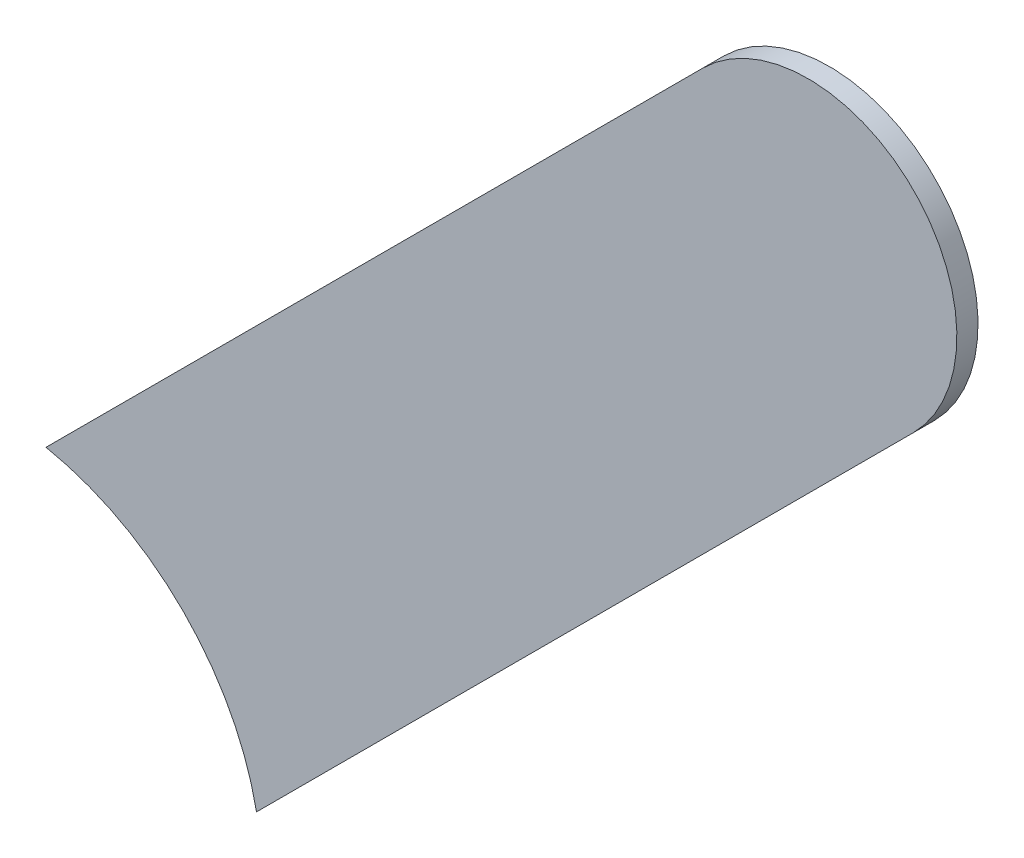
ISO-10303-21;
HEADER;
FILE_DESCRIPTION(('STEP AP214'),'2;1');
FILE_NAME('part.step','',(''),(''),'','','');
FILE_SCHEMA(('AUTOMOTIVE_DESIGN { 1 0 10303 214 1 1 1 1 }'));
ENDSEC;
DATA;
#1=APPLICATION_CONTEXT('core data for automotive mechanical design processes');
#2=APPLICATION_PROTOCOL_DEFINITION('international standard','automotive_design',2000,#1);
#3=PRODUCT_CONTEXT('',#1,'mechanical');
#4=PRODUCT('Part','Part','',(#3));
#5=PRODUCT_RELATED_PRODUCT_CATEGORY('part','',(#4));
#6=PRODUCT_DEFINITION_FORMATION('','',#4);
#7=PRODUCT_DEFINITION_CONTEXT('part definition',#1,'design');
#8=PRODUCT_DEFINITION('design','',#6,#7);
#9=PRODUCT_DEFINITION_SHAPE('','',#8);
#10=(LENGTH_UNIT() NAMED_UNIT(*) SI_UNIT(.MILLI.,.METRE.));
#11=(NAMED_UNIT(*) PLANE_ANGLE_UNIT() SI_UNIT($,.RADIAN.));
#12=(NAMED_UNIT(*) SI_UNIT($,.STERADIAN.) SOLID_ANGLE_UNIT());
#13=UNCERTAINTY_MEASURE_WITH_UNIT(LENGTH_MEASURE(1.E-05),#10,'distance_accuracy_value','');
#14=(GEOMETRIC_REPRESENTATION_CONTEXT(3) GLOBAL_UNCERTAINTY_ASSIGNED_CONTEXT((#13)) GLOBAL_UNIT_ASSIGNED_CONTEXT((#10,
#11,#12)) REPRESENTATION_CONTEXT('',''));
#15=CARTESIAN_POINT('',(0.,0.,0.));
#16=DIRECTION('',(0.,0.,1.));
#17=DIRECTION('',(1.,0.,0.));
#18=AXIS2_PLACEMENT_3D('',#15,#16,#17);
#19=CARTESIAN_POINT('',(34.3413517363948,98.5877993163948,0.));
#20=DIRECTION('',(-0.707106781186546,0.707106781186549,0.));
#21=DIRECTION('',(0.707106781186549,0.707106781186546,0.));
#22=AXIS2_PLACEMENT_3D('',#19,#20,#21);
#23=PLANE('',#22);
#24=DIRECTION('',(0.707106781186549,0.707106781186546,0.));
#25=VECTOR('',#24,1.);
#26=CARTESIAN_POINT('',(34.07677716,98.32322474,0.03556));
#27=LINE('',#26,#25);
#28=CARTESIAN_POINT('',(34.3413517363948,98.5877993163948,0.03556));
#29=VERTEX_POINT('',#28);
#30=CARTESIAN_POINT('',(35.4443538,99.69080138,0.03556));
#31=VERTEX_POINT('',#30);
#32=EDGE_CURVE('E11',#29,#31,#27,.T.);
#33=ORIENTED_EDGE('',*,*,#32,.F.);
#34=DIRECTION('',(0.,0.,1.));
#35=VECTOR('',#34,1.);
#36=CARTESIAN_POINT('',(34.3413517363948,98.5877993163948,0.));
#37=LINE('',#36,#35);
#38=CARTESIAN_POINT('',(34.3413517363948,98.5877993163948,0.));
#39=VERTEX_POINT('',#38);
#40=EDGE_CURVE('E24',#39,#29,#37,.T.);
#41=ORIENTED_EDGE('',*,*,#40,.F.);
#42=DIRECTION('',(0.707106781186549,0.707106781186546,0.));
#43=VECTOR('',#42,1.);
#44=CARTESIAN_POINT('',(34.07677716,98.32322474,0.));
#45=LINE('',#44,#43);
#46=CARTESIAN_POINT('',(35.4443538,99.69080138,0.));
#47=VERTEX_POINT('',#46);
#48=EDGE_CURVE('E75',#39,#47,#45,.T.);
#49=ORIENTED_EDGE('',*,*,#48,.T.);
#50=DIRECTION('',(0.,0.,1.));
#51=VECTOR('',#50,1.);
#52=CARTESIAN_POINT('',(35.4443538,99.69080138,0.));
#53=LINE('',#52,#51);
#54=EDGE_CURVE('E37',#47,#31,#53,.T.);
#55=ORIENTED_EDGE('',*,*,#54,.T.);
#56=EDGE_LOOP('',(#33,#41,#49,#55));
#57=FACE_BOUND('',#56,.T.);
#58=ADVANCED_FACE('F17',(#57),#23,.F.);
#59=CARTESIAN_POINT('',(35.26757742,99.86757776,0.));
#60=DIRECTION('',(0.,0.,-1.));
#61=DIRECTION('',(0.707106781186576,-0.707106781186519,0.));
#62=AXIS2_PLACEMENT_3D('',#59,#60,#61);
#63=CYLINDRICAL_SURFACE('',#62,0.249999554103225);
#64=CARTESIAN_POINT('',(35.26757742,99.86757776,0.03556));
#65=DIRECTION('',(0.,0.,1.));
#66=DIRECTION('',(0.707106781186576,-0.707106781186519,0.));
#67=AXIS2_PLACEMENT_3D('',#64,#65,#66);
#68=CIRCLE('',#67,0.249999554103225);
#69=CARTESIAN_POINT('',(35.09080104,100.04435414,0.03556));
#70=VERTEX_POINT('',#69);
#71=EDGE_CURVE('E83',#31,#70,#68,.T.);
#72=ORIENTED_EDGE('',*,*,#71,.F.);
#73=ORIENTED_EDGE('',*,*,#54,.F.);
#74=CARTESIAN_POINT('',(35.26757742,99.86757776,0.));
#75=DIRECTION('',(0.,0.,1.));
#76=DIRECTION('',(0.707106781186576,-0.707106781186519,0.));
#77=AXIS2_PLACEMENT_3D('',#74,#75,#76);
#78=CIRCLE('',#77,0.249999554103225);
#79=CARTESIAN_POINT('',(35.09080104,100.04435414,0.));
#80=VERTEX_POINT('',#79);
#81=EDGE_CURVE('E81',#47,#80,#78,.T.);
#82=ORIENTED_EDGE('',*,*,#81,.T.);
#83=DIRECTION('',(0.,0.,1.));
#84=VECTOR('',#83,1.);
#85=CARTESIAN_POINT('',(35.09080104,100.04435414,0.));
#86=LINE('',#85,#84);
#87=EDGE_CURVE('E67',#80,#70,#86,.T.);
#88=ORIENTED_EDGE('',*,*,#87,.T.);
#89=EDGE_LOOP('',(#72,#73,#82,#88));
#90=FACE_BOUND('',#89,.T.);
#91=ADVANCED_FACE('F89',(#90),#63,.T.);
#92=CARTESIAN_POINT('',(35.09080104,100.04435414,0.));
#93=DIRECTION('',(0.707106781186551,-0.707106781186544,0.));
#94=DIRECTION('',(-0.707106781186544,-0.707106781186551,0.));
#95=AXIS2_PLACEMENT_3D('',#92,#93,#94);
#96=PLANE('',#95);
#97=DIRECTION('',(-0.707106781186544,-0.707106781186551,0.));
#98=VECTOR('',#97,1.);
#99=CARTESIAN_POINT('',(35.09080104,100.04435414,0.03556));
#100=LINE('',#99,#98);
#101=CARTESIAN_POINT('',(33.9877989763948,98.9413520763948,0.03556));
#102=VERTEX_POINT('',#101);
#103=EDGE_CURVE('E71',#70,#102,#100,.T.);
#104=ORIENTED_EDGE('',*,*,#103,.F.);
#105=ORIENTED_EDGE('',*,*,#87,.F.);
#106=DIRECTION('',(-0.707106781186544,-0.707106781186551,0.));
#107=VECTOR('',#106,1.);
#108=CARTESIAN_POINT('',(35.09080104,100.04435414,0.));
#109=LINE('',#108,#107);
#110=CARTESIAN_POINT('',(33.9877989763948,98.9413520763948,0.));
#111=VERTEX_POINT('',#110);
#112=EDGE_CURVE('E63',#80,#111,#109,.T.);
#113=ORIENTED_EDGE('',*,*,#112,.T.);
#114=DIRECTION('',(0.,0.,1.));
#115=VECTOR('',#114,1.);
#116=CARTESIAN_POINT('',(33.9877989763948,98.9413520763948,0.));
#117=LINE('',#116,#115);
#118=EDGE_CURVE('E53',#111,#102,#117,.T.);
#119=ORIENTED_EDGE('',*,*,#118,.T.);
#120=EDGE_LOOP('',(#104,#105,#113,#119));
#121=FACE_BOUND('',#120,.T.);
#122=ADVANCED_FACE('F66',(#121),#96,.F.);
#123=CARTESIAN_POINT('',(33.90000078,98.50000112,0.));
#124=DIRECTION('',(0.,0.,-1.));
#125=DIRECTION('',(1.,0.,0.));
#126=AXIS2_PLACEMENT_3D('',#123,#124,#125);
#127=CYLINDRICAL_SURFACE('',#126,0.4499991);
#128=ORIENTED_EDGE('',*,*,#40,.T.);
#129=CARTESIAN_POINT('',(33.90000078,98.50000112,0.03556));
#130=DIRECTION('',(0.,0.,1.));
#131=DIRECTION('',(1.,0.,0.));
#132=AXIS2_PLACEMENT_3D('',#129,#130,#131);
#133=CIRCLE('',#132,0.4499991);
#134=EDGE_CURVE('E59',#29,#102,#133,.T.);
#135=ORIENTED_EDGE('',*,*,#134,.T.);
#136=ORIENTED_EDGE('',*,*,#118,.F.);
#137=CARTESIAN_POINT('',(33.90000078,98.50000112,0.));
#138=DIRECTION('',(0.,0.,1.));
#139=DIRECTION('',(1.,0.,0.));
#140=AXIS2_PLACEMENT_3D('',#137,#138,#139);
#141=CIRCLE('',#140,0.4499991);
#142=EDGE_CURVE('E57',#39,#111,#141,.T.);
#143=ORIENTED_EDGE('',*,*,#142,.F.);
#144=EDGE_LOOP('',(#128,#135,#136,#143));
#145=FACE_BOUND('',#144,.T.);
#146=ADVANCED_FACE('F55',(#145),#127,.F.);
#147=CARTESIAN_POINT('',(34.07677716,98.32322474,0.));
#148=DIRECTION('',(0.,0.,-1.));
#149=DIRECTION('',(-1.,0.,0.));
#150=AXIS2_PLACEMENT_3D('',#147,#148,#149);
#151=PLANE('',#150);
#152=ORIENTED_EDGE('',*,*,#48,.F.);
#153=ORIENTED_EDGE('',*,*,#142,.T.);
#154=ORIENTED_EDGE('',*,*,#112,.F.);
#155=ORIENTED_EDGE('',*,*,#81,.F.);
#156=EDGE_LOOP('',(#152,#153,#154,#155));
#157=FACE_BOUND('',#156,.T.);
#158=ADVANCED_FACE('F74',(#157),#151,.T.);
#159=CARTESIAN_POINT('',(34.07677716,98.32322474,0.03556));
#160=DIRECTION('',(0.,0.,-1.));
#161=DIRECTION('',(-1.,0.,0.));
#162=AXIS2_PLACEMENT_3D('',#159,#160,#161);
#163=PLANE('',#162);
#164=ORIENTED_EDGE('',*,*,#134,.F.);
#165=ORIENTED_EDGE('',*,*,#32,.T.);
#166=ORIENTED_EDGE('',*,*,#71,.T.);
#167=ORIENTED_EDGE('',*,*,#103,.T.);
#168=EDGE_LOOP('',(#164,#165,#166,#167));
#169=FACE_BOUND('',#168,.T.);
#170=ADVANCED_FACE('F91',(#169),#163,.F.);
#171=CLOSED_SHELL('',(#58,#91,#122,#146,#158,#170));
#172=MANIFOLD_SOLID_BREP('B1',#171);
#173=ADVANCED_BREP_SHAPE_REPRESENTATION('',(#18,#172),#14);
#174=SHAPE_DEFINITION_REPRESENTATION(#9,#173);
ENDSEC;
END-ISO-10303-21;
